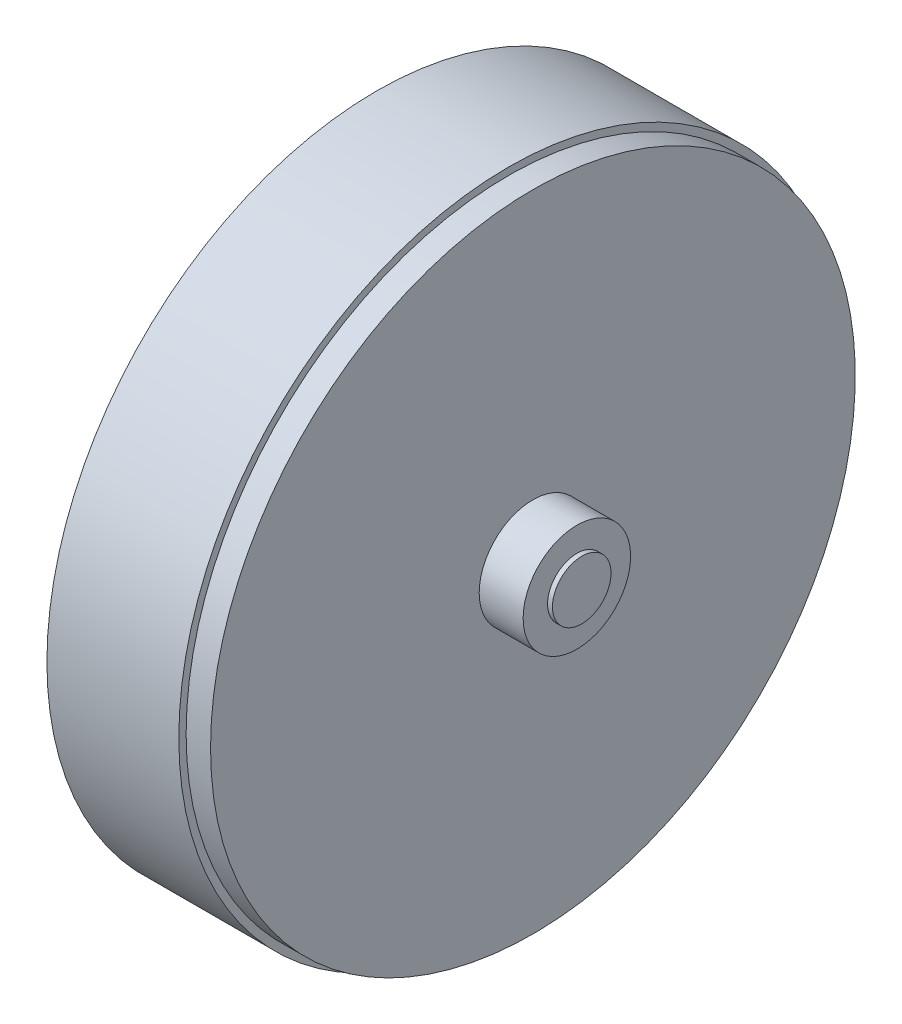
ISO-10303-21;
HEADER;
FILE_DESCRIPTION(('STEP AP214'),'2;1');
FILE_NAME('part.step','',(''),(''),'','','');
FILE_SCHEMA(('AUTOMOTIVE_DESIGN { 1 0 10303 214 1 1 1 1 }'));
ENDSEC;
DATA;
#1=APPLICATION_CONTEXT('core data for automotive mechanical design processes');
#2=APPLICATION_PROTOCOL_DEFINITION('international standard','automotive_design',2000,#1);
#3=PRODUCT_CONTEXT('',#1,'mechanical');
#4=PRODUCT('Part','Part','',(#3));
#5=PRODUCT_RELATED_PRODUCT_CATEGORY('part','',(#4));
#6=PRODUCT_DEFINITION_FORMATION('','',#4);
#7=PRODUCT_DEFINITION_CONTEXT('part definition',#1,'design');
#8=PRODUCT_DEFINITION('design','',#6,#7);
#9=PRODUCT_DEFINITION_SHAPE('','',#8);
#10=(LENGTH_UNIT() NAMED_UNIT(*) SI_UNIT(.MILLI.,.METRE.));
#11=(NAMED_UNIT(*) PLANE_ANGLE_UNIT() SI_UNIT($,.RADIAN.));
#12=(NAMED_UNIT(*) SI_UNIT($,.STERADIAN.) SOLID_ANGLE_UNIT());
#13=UNCERTAINTY_MEASURE_WITH_UNIT(LENGTH_MEASURE(1.E-05),#10,'distance_accuracy_value','');
#14=(GEOMETRIC_REPRESENTATION_CONTEXT(3) GLOBAL_UNCERTAINTY_ASSIGNED_CONTEXT((#13)) GLOBAL_UNIT_ASSIGNED_CONTEXT((#10,
#11,#12)) REPRESENTATION_CONTEXT('',''));
#15=CARTESIAN_POINT('',(0.,0.,0.));
#16=DIRECTION('',(0.,0.,1.));
#17=DIRECTION('',(1.,0.,0.));
#18=AXIS2_PLACEMENT_3D('',#15,#16,#17);
#19=CARTESIAN_POINT('',(0.,0.,0.));
#20=DIRECTION('',(-1.,0.,0.));
#21=DIRECTION('',(0.,0.,1.));
#22=AXIS2_PLACEMENT_3D('',#19,#20,#21);
#23=PLANE('',#22);
#24=CARTESIAN_POINT('',(0.,0.,0.));
#25=DIRECTION('',(-1.,0.,0.));
#26=DIRECTION('',(0.,0.,1.));
#27=AXIS2_PLACEMENT_3D('',#24,#25,#26);
#28=CIRCLE('',#27,3.);
#29=CARTESIAN_POINT('',(0.,0.,3.));
#30=VERTEX_POINT('',#29);
#31=EDGE_CURVE('E10',#30,#30,#28,.T.);
#32=ORIENTED_EDGE('',*,*,#31,.F.);
#33=EDGE_LOOP('',(#32));
#34=FACE_BOUND('',#33,.T.);
#35=ADVANCED_FACE('F44',(#34),#23,.F.);
#36=CARTESIAN_POINT('',(-34.0088849839102,0.,0.));
#37=DIRECTION('',(-1.,0.,0.));
#38=DIRECTION('',(0.,0.,1.));
#39=AXIS2_PLACEMENT_3D('',#36,#37,#38);
#40=CYLINDRICAL_SURFACE('',#39,3.);
#41=CARTESIAN_POINT('',(-0.5,0.,0.));
#42=DIRECTION('',(-1.,0.,0.));
#43=DIRECTION('',(0.,0.,1.));
#44=AXIS2_PLACEMENT_3D('',#41,#42,#43);
#45=CIRCLE('',#44,3.);
#46=CARTESIAN_POINT('',(-0.5,0.,3.));
#47=VERTEX_POINT('',#46);
#48=EDGE_CURVE('E55',#47,#47,#45,.T.);
#49=ORIENTED_EDGE('',*,*,#48,.F.);
#50=EDGE_LOOP('',(#49));
#51=FACE_BOUND('',#50,.T.);
#52=ORIENTED_EDGE('',*,*,#31,.T.);
#53=EDGE_LOOP('',(#52));
#54=FACE_BOUND('',#53,.T.);
#55=ADVANCED_FACE('F233',(#51,#54),#40,.T.);
#56=CARTESIAN_POINT('',(-0.5,3.,0.));
#57=DIRECTION('',(-1.,0.,0.));
#58=DIRECTION('',(0.,0.,1.));
#59=AXIS2_PLACEMENT_3D('',#56,#57,#58);
#60=PLANE('',#59);
#61=CARTESIAN_POINT('',(-0.5,0.,0.));
#62=DIRECTION('',(-1.,0.,0.));
#63=DIRECTION('',(0.,0.,1.));
#64=AXIS2_PLACEMENT_3D('',#61,#62,#63);
#65=CIRCLE('',#64,5.5);
#66=CARTESIAN_POINT('',(-0.5,0.,5.5));
#67=VERTEX_POINT('',#66);
#68=EDGE_CURVE('E60',#67,#67,#65,.T.);
#69=ORIENTED_EDGE('',*,*,#68,.F.);
#70=EDGE_LOOP('',(#69));
#71=FACE_BOUND('',#70,.T.);
#72=ORIENTED_EDGE('',*,*,#48,.T.);
#73=EDGE_LOOP('',(#72));
#74=FACE_BOUND('',#73,.T.);
#75=ADVANCED_FACE('F228',(#71,#74),#60,.F.);
#76=CARTESIAN_POINT('',(-34.0088849839102,0.,0.));
#77=DIRECTION('',(-1.,0.,0.));
#78=DIRECTION('',(0.,0.,1.));
#79=AXIS2_PLACEMENT_3D('',#76,#77,#78);
#80=CYLINDRICAL_SURFACE('',#79,5.5);
#81=CARTESIAN_POINT('',(-5.,0.,0.));
#82=DIRECTION('',(-1.,0.,0.));
#83=DIRECTION('',(0.,0.,1.));
#84=AXIS2_PLACEMENT_3D('',#81,#82,#83);
#85=CIRCLE('',#84,5.5);
#86=CARTESIAN_POINT('',(-5.,0.,5.5));
#87=VERTEX_POINT('',#86);
#88=EDGE_CURVE('E65',#87,#87,#85,.T.);
#89=ORIENTED_EDGE('',*,*,#88,.F.);
#90=EDGE_LOOP('',(#89));
#91=FACE_BOUND('',#90,.T.);
#92=ORIENTED_EDGE('',*,*,#68,.T.);
#93=EDGE_LOOP('',(#92));
#94=FACE_BOUND('',#93,.T.);
#95=ADVANCED_FACE('F219',(#91,#94),#80,.T.);
#96=CARTESIAN_POINT('',(-5.,5.5,0.));
#97=DIRECTION('',(-1.,0.,0.));
#98=DIRECTION('',(0.,0.,1.));
#99=AXIS2_PLACEMENT_3D('',#96,#97,#98);
#100=PLANE('',#99);
#101=CARTESIAN_POINT('',(-5.,0.,0.));
#102=DIRECTION('',(-1.,0.,0.));
#103=DIRECTION('',(0.,0.,1.));
#104=AXIS2_PLACEMENT_3D('',#101,#102,#103);
#105=CIRCLE('',#104,33.);
#106=CARTESIAN_POINT('',(-5.,0.,33.));
#107=VERTEX_POINT('',#106);
#108=EDGE_CURVE('E68',#107,#107,#105,.T.);
#109=ORIENTED_EDGE('',*,*,#108,.F.);
#110=EDGE_LOOP('',(#109));
#111=FACE_BOUND('',#110,.T.);
#112=ORIENTED_EDGE('',*,*,#88,.T.);
#113=EDGE_LOOP('',(#112));
#114=FACE_BOUND('',#113,.T.);
#115=ADVANCED_FACE('F211',(#111,#114),#100,.F.);
#116=CARTESIAN_POINT('',(-34.0088849839102,0.,0.));
#117=DIRECTION('',(-1.,0.,0.));
#118=DIRECTION('',(0.,0.,1.));
#119=AXIS2_PLACEMENT_3D('',#116,#117,#118);
#120=CYLINDRICAL_SURFACE('',#119,33.);
#121=CARTESIAN_POINT('',(-7.5,0.,0.));
#122=DIRECTION('',(-1.,0.,0.));
#123=DIRECTION('',(0.,0.,1.));
#124=AXIS2_PLACEMENT_3D('',#121,#122,#123);
#125=CIRCLE('',#124,33.);
#126=CARTESIAN_POINT('',(-7.5,0.,33.));
#127=VERTEX_POINT('',#126);
#128=EDGE_CURVE('E75',#127,#127,#125,.T.);
#129=ORIENTED_EDGE('',*,*,#128,.F.);
#130=EDGE_LOOP('',(#129));
#131=FACE_BOUND('',#130,.T.);
#132=ORIENTED_EDGE('',*,*,#108,.T.);
#133=EDGE_LOOP('',(#132));
#134=FACE_BOUND('',#133,.T.);
#135=ADVANCED_FACE('F206',(#131,#134),#120,.T.);
#136=CARTESIAN_POINT('',(-7.5,33.75,0.));
#137=DIRECTION('',(-1.,0.,0.));
#138=DIRECTION('',(0.,0.,1.));
#139=AXIS2_PLACEMENT_3D('',#136,#137,#138);
#140=PLANE('',#139);
#141=CARTESIAN_POINT('',(-7.5,0.,0.));
#142=DIRECTION('',(-1.,0.,0.));
#143=DIRECTION('',(0.,0.,1.));
#144=AXIS2_PLACEMENT_3D('',#141,#142,#143);
#145=CIRCLE('',#144,33.75);
#146=CARTESIAN_POINT('',(-7.5,0.,33.75));
#147=VERTEX_POINT('',#146);
#148=EDGE_CURVE('E77',#147,#147,#145,.T.);
#149=ORIENTED_EDGE('',*,*,#148,.F.);
#150=EDGE_LOOP('',(#149));
#151=FACE_BOUND('',#150,.T.);
#152=ORIENTED_EDGE('',*,*,#128,.T.);
#153=EDGE_LOOP('',(#152));
#154=FACE_BOUND('',#153,.T.);
#155=ADVANCED_FACE('F205',(#151,#154),#140,.F.);
#156=CARTESIAN_POINT('',(-34.0088849839102,0.,0.));
#157=DIRECTION('',(-1.,0.,0.));
#158=DIRECTION('',(0.,0.,1.));
#159=AXIS2_PLACEMENT_3D('',#156,#157,#158);
#160=CYLINDRICAL_SURFACE('',#159,33.75);
#161=CARTESIAN_POINT('',(-21.,0.,0.));
#162=DIRECTION('',(-1.,0.,0.));
#163=DIRECTION('',(0.,0.,1.));
#164=AXIS2_PLACEMENT_3D('',#161,#162,#163);
#165=CIRCLE('',#164,33.75);
#166=CARTESIAN_POINT('',(-21.,0.,33.75));
#167=VERTEX_POINT('',#166);
#168=EDGE_CURVE('E78',#167,#167,#165,.T.);
#169=ORIENTED_EDGE('',*,*,#168,.F.);
#170=EDGE_LOOP('',(#169));
#171=FACE_BOUND('',#170,.T.);
#172=ORIENTED_EDGE('',*,*,#148,.T.);
#173=EDGE_LOOP('',(#172));
#174=FACE_BOUND('',#173,.T.);
#175=ADVANCED_FACE('F196',(#171,#174),#160,.T.);
#176=CARTESIAN_POINT('',(-21.,33.75,0.));
#177=DIRECTION('',(1.,0.,0.));
#178=DIRECTION('',(0.,0.,-1.));
#179=AXIS2_PLACEMENT_3D('',#176,#177,#178);
#180=PLANE('',#179);
#181=CARTESIAN_POINT('',(-21.,0.,0.));
#182=DIRECTION('',(-1.,0.,0.));
#183=DIRECTION('',(0.,0.,1.));
#184=AXIS2_PLACEMENT_3D('',#181,#182,#183);
#185=CIRCLE('',#184,22.);
#186=CARTESIAN_POINT('',(-21.,0.,22.));
#187=VERTEX_POINT('',#186);
#188=EDGE_CURVE('E81',#187,#187,#185,.T.);
#189=ORIENTED_EDGE('',*,*,#188,.F.);
#190=EDGE_LOOP('',(#189));
#191=FACE_BOUND('',#190,.T.);
#192=ORIENTED_EDGE('',*,*,#168,.T.);
#193=EDGE_LOOP('',(#192));
#194=FACE_BOUND('',#193,.T.);
#195=ADVANCED_FACE('F188',(#191,#194),#180,.F.);
#196=CARTESIAN_POINT('',(-34.0088849839102,0.,0.));
#197=DIRECTION('',(-1.,0.,0.));
#198=DIRECTION('',(0.,0.,1.));
#199=AXIS2_PLACEMENT_3D('',#196,#197,#198);
#200=CYLINDRICAL_SURFACE('',#199,22.);
#201=CARTESIAN_POINT('',(-25.,0.,0.));
#202=DIRECTION('',(-1.,0.,0.));
#203=DIRECTION('',(0.,0.,1.));
#204=AXIS2_PLACEMENT_3D('',#201,#202,#203);
#205=CIRCLE('',#204,22.);
#206=CARTESIAN_POINT('',(-25.,0.,22.));
#207=VERTEX_POINT('',#206);
#208=EDGE_CURVE('E88',#207,#207,#205,.T.);
#209=ORIENTED_EDGE('',*,*,#208,.F.);
#210=EDGE_LOOP('',(#209));
#211=FACE_BOUND('',#210,.T.);
#212=ORIENTED_EDGE('',*,*,#188,.T.);
#213=EDGE_LOOP('',(#212));
#214=FACE_BOUND('',#213,.T.);
#215=ADVANCED_FACE('F177',(#211,#214),#200,.T.);
#216=CARTESIAN_POINT('',(-25.,22.,0.));
#217=DIRECTION('',(1.,0.,0.));
#218=DIRECTION('',(0.,0.,-1.));
#219=AXIS2_PLACEMENT_3D('',#216,#217,#218);
#220=PLANE('',#219);
#221=CARTESIAN_POINT('',(-25.,7.74933950539307,-18.7085605333536));
#222=DIRECTION('',(-1.,0.,0.));
#223=DIRECTION('',(0.,0.,1.));
#224=AXIS2_PLACEMENT_3D('',#221,#222,#223);
#225=CIRCLE('',#224,1.25);
#226=CARTESIAN_POINT('',(-25.,7.74933950539307,-17.4585605333536));
#227=VERTEX_POINT('',#226);
#228=EDGE_CURVE('E122',#227,#227,#225,.T.);
#229=ORIENTED_EDGE('',*,*,#228,.F.);
#230=EDGE_LOOP('',(#229));
#231=FACE_BOUND('',#230,.T.);
#232=CARTESIAN_POINT('',(-25.,-7.74933950539307,-18.7085605333536));
#233=DIRECTION('',(-1.,0.,0.));
#234=DIRECTION('',(0.,0.,1.));
#235=AXIS2_PLACEMENT_3D('',#232,#233,#234);
#236=CIRCLE('',#235,1.25);
#237=CARTESIAN_POINT('',(-25.,-7.74933950539307,-17.4585605333536));
#238=VERTEX_POINT('',#237);
#239=EDGE_CURVE('E126',#238,#238,#236,.T.);
#240=ORIENTED_EDGE('',*,*,#239,.F.);
#241=EDGE_LOOP('',(#240));
#242=FACE_BOUND('',#241,.T.);
#243=CARTESIAN_POINT('',(-25.,-18.7085605333536,-7.74933950539306));
#244=DIRECTION('',(-1.,0.,0.));
#245=DIRECTION('',(0.,0.,1.));
#246=AXIS2_PLACEMENT_3D('',#243,#244,#245);
#247=CIRCLE('',#246,1.25);
#248=CARTESIAN_POINT('',(-25.,-18.7085605333536,-6.49933950539307));
#249=VERTEX_POINT('',#248);
#250=EDGE_CURVE('E140',#249,#249,#247,.T.);
#251=ORIENTED_EDGE('',*,*,#250,.F.);
#252=EDGE_LOOP('',(#251));
#253=FACE_BOUND('',#252,.T.);
#254=CARTESIAN_POINT('',(-25.,-18.7085605333536,7.74933950539307));
#255=DIRECTION('',(-1.,0.,0.));
#256=DIRECTION('',(0.,0.,1.));
#257=AXIS2_PLACEMENT_3D('',#254,#255,#256);
#258=CIRCLE('',#257,1.25);
#259=CARTESIAN_POINT('',(-25.,-18.7085605333536,8.99933950539307));
#260=VERTEX_POINT('',#259);
#261=EDGE_CURVE('E143',#260,#260,#258,.T.);
#262=ORIENTED_EDGE('',*,*,#261,.F.);
#263=EDGE_LOOP('',(#262));
#264=FACE_BOUND('',#263,.T.);
#265=CARTESIAN_POINT('',(-25.,-7.74933950539307,18.7085605333536));
#266=DIRECTION('',(-1.,0.,0.));
#267=DIRECTION('',(0.,0.,1.));
#268=AXIS2_PLACEMENT_3D('',#265,#266,#267);
#269=CIRCLE('',#268,1.25);
#270=CARTESIAN_POINT('',(-25.,-7.74933950539307,19.9585605333536));
#271=VERTEX_POINT('',#270);
#272=EDGE_CURVE('E153',#271,#271,#269,.T.);
#273=ORIENTED_EDGE('',*,*,#272,.F.);
#274=EDGE_LOOP('',(#273));
#275=FACE_BOUND('',#274,.T.);
#276=CARTESIAN_POINT('',(-25.,7.74933950539307,18.7085605333536));
#277=DIRECTION('',(-1.,0.,0.));
#278=DIRECTION('',(0.,0.,1.));
#279=AXIS2_PLACEMENT_3D('',#276,#277,#278);
#280=CIRCLE('',#279,1.25);
#281=CARTESIAN_POINT('',(-25.,7.74933950539307,19.9585605333536));
#282=VERTEX_POINT('',#281);
#283=EDGE_CURVE('E163',#282,#282,#280,.T.);
#284=ORIENTED_EDGE('',*,*,#283,.F.);
#285=EDGE_LOOP('',(#284));
#286=FACE_BOUND('',#285,.T.);
#287=CARTESIAN_POINT('',(-25.,18.7085605333536,7.74933950539307));
#288=DIRECTION('',(-1.,0.,0.));
#289=DIRECTION('',(0.,0.,1.));
#290=AXIS2_PLACEMENT_3D('',#287,#288,#289);
#291=CIRCLE('',#290,1.25);
#292=CARTESIAN_POINT('',(-25.,18.7085605333536,8.99933950539306));
#293=VERTEX_POINT('',#292);
#294=EDGE_CURVE('E113',#293,#293,#291,.T.);
#295=ORIENTED_EDGE('',*,*,#294,.F.);
#296=EDGE_LOOP('',(#295));
#297=FACE_BOUND('',#296,.T.);
#298=CARTESIAN_POINT('',(-25.,18.7085605333536,-7.74933950539307));
#299=DIRECTION('',(-1.,0.,0.));
#300=DIRECTION('',(0.,0.,1.));
#301=AXIS2_PLACEMENT_3D('',#298,#299,#300);
#302=CIRCLE('',#301,1.25);
#303=CARTESIAN_POINT('',(-25.,18.7085605333536,-6.49933950539307));
#304=VERTEX_POINT('',#303);
#305=EDGE_CURVE('E107',#304,#304,#302,.T.);
#306=ORIENTED_EDGE('',*,*,#305,.F.);
#307=EDGE_LOOP('',(#306));
#308=FACE_BOUND('',#307,.T.);
#309=CARTESIAN_POINT('',(-25.,0.,0.));
#310=DIRECTION('',(-1.,0.,0.));
#311=DIRECTION('',(0.,0.,1.));
#312=AXIS2_PLACEMENT_3D('',#309,#310,#311);
#313=CIRCLE('',#312,18.);
#314=CARTESIAN_POINT('',(-25.,0.,18.));
#315=VERTEX_POINT('',#314);
#316=EDGE_CURVE('E95',#315,#315,#313,.T.);
#317=ORIENTED_EDGE('',*,*,#316,.F.);
#318=EDGE_LOOP('',(#317));
#319=FACE_BOUND('',#318,.T.);
#320=ORIENTED_EDGE('',*,*,#208,.T.);
#321=EDGE_LOOP('',(#320));
#322=FACE_BOUND('',#321,.T.);
#323=ADVANCED_FACE('F174',(#231,#242,#253,#264,#275,#286,#297,#308,#319,#322),#220,.F.);
#324=CARTESIAN_POINT('',(-34.0088849839102,0.,0.));
#325=DIRECTION('',(-1.,0.,0.));
#326=DIRECTION('',(0.,0.,1.));
#327=AXIS2_PLACEMENT_3D('',#324,#325,#326);
#328=CYLINDRICAL_SURFACE('',#327,18.);
#329=CARTESIAN_POINT('',(-27.,0.,0.));
#330=DIRECTION('',(-1.,0.,0.));
#331=DIRECTION('',(0.,0.,1.));
#332=AXIS2_PLACEMENT_3D('',#329,#330,#331);
#333=CIRCLE('',#332,18.);
#334=CARTESIAN_POINT('',(-27.,0.,18.));
#335=VERTEX_POINT('',#334);
#336=EDGE_CURVE('E98',#335,#335,#333,.T.);
#337=ORIENTED_EDGE('',*,*,#336,.F.);
#338=EDGE_LOOP('',(#337));
#339=FACE_BOUND('',#338,.T.);
#340=ORIENTED_EDGE('',*,*,#316,.T.);
#341=EDGE_LOOP('',(#340));
#342=FACE_BOUND('',#341,.T.);
#343=ADVANCED_FACE('F178',(#339,#342),#328,.T.);
#344=CARTESIAN_POINT('',(-27.,18.,0.));
#345=DIRECTION('',(1.,0.,0.));
#346=DIRECTION('',(0.,0.,-1.));
#347=AXIS2_PLACEMENT_3D('',#344,#345,#346);
#348=PLANE('',#347);
#349=CARTESIAN_POINT('',(-27.,0.,0.));
#350=DIRECTION('',(-1.,0.,0.));
#351=DIRECTION('',(0.,0.,1.));
#352=AXIS2_PLACEMENT_3D('',#349,#350,#351);
#353=CIRCLE('',#352,17.);
#354=CARTESIAN_POINT('',(-27.,0.,17.));
#355=VERTEX_POINT('',#354);
#356=EDGE_CURVE('E99',#355,#355,#353,.T.);
#357=ORIENTED_EDGE('',*,*,#356,.F.);
#358=EDGE_LOOP('',(#357));
#359=FACE_BOUND('',#358,.T.);
#360=ORIENTED_EDGE('',*,*,#336,.T.);
#361=EDGE_LOOP('',(#360));
#362=FACE_BOUND('',#361,.T.);
#363=ADVANCED_FACE('F309',(#359,#362),#348,.F.);
#364=CARTESIAN_POINT('',(-34.0088849839102,0.,0.));
#365=DIRECTION('',(-1.,0.,0.));
#366=DIRECTION('',(0.,0.,1.));
#367=AXIS2_PLACEMENT_3D('',#364,#365,#366);
#368=CYLINDRICAL_SURFACE('',#367,17.);
#369=CARTESIAN_POINT('',(-30.5,0.,0.));
#370=DIRECTION('',(-1.,0.,0.));
#371=DIRECTION('',(0.,0.,1.));
#372=AXIS2_PLACEMENT_3D('',#369,#370,#371);
#373=CIRCLE('',#372,17.);
#374=CARTESIAN_POINT('',(-30.5,0.,17.));
#375=VERTEX_POINT('',#374);
#376=EDGE_CURVE('E104',#375,#375,#373,.T.);
#377=ORIENTED_EDGE('',*,*,#376,.F.);
#378=EDGE_LOOP('',(#377));
#379=FACE_BOUND('',#378,.T.);
#380=ORIENTED_EDGE('',*,*,#356,.T.);
#381=EDGE_LOOP('',(#380));
#382=FACE_BOUND('',#381,.T.);
#383=ADVANCED_FACE('F318',(#379,#382),#368,.T.);
#384=CARTESIAN_POINT('',(-30.5,17.,0.));
#385=DIRECTION('',(1.,0.,0.));
#386=DIRECTION('',(0.,0.,-1.));
#387=AXIS2_PLACEMENT_3D('',#384,#385,#386);
#388=PLANE('',#387);
#389=ORIENTED_EDGE('',*,*,#376,.T.);
#390=EDGE_LOOP('',(#389));
#391=FACE_BOUND('',#390,.T.);
#392=ADVANCED_FACE('F329',(#391),#388,.F.);
#393=CARTESIAN_POINT('',(-21.,18.7085605333536,-7.74933950539307));
#394=DIRECTION('',(-1.,0.,0.));
#395=DIRECTION('',(0.,0.,1.));
#396=AXIS2_PLACEMENT_3D('',#393,#394,#395);
#397=CYLINDRICAL_SURFACE('',#396,1.25);
#398=CARTESIAN_POINT('',(-21.,18.7085605333536,-7.74933950539307));
#399=DIRECTION('',(-1.,0.,0.));
#400=DIRECTION('',(0.,0.,1.));
#401=AXIS2_PLACEMENT_3D('',#398,#399,#400);
#402=CIRCLE('',#401,1.25);
#403=CARTESIAN_POINT('',(-21.,18.7085605333536,-6.49933950539307));
#404=VERTEX_POINT('',#403);
#405=EDGE_CURVE('E108',#404,#404,#402,.T.);
#406=ORIENTED_EDGE('',*,*,#405,.F.);
#407=EDGE_LOOP('',(#406));
#408=FACE_BOUND('',#407,.T.);
#409=ORIENTED_EDGE('',*,*,#305,.T.);
#410=EDGE_LOOP('',(#409));
#411=FACE_BOUND('',#410,.T.);
#412=ADVANCED_FACE('F339',(#408,#411),#397,.F.);
#413=CARTESIAN_POINT('',(-21.,18.7085605333536,-7.74933950539307));
#414=DIRECTION('',(-1.,0.,0.));
#415=DIRECTION('',(0.,0.,1.));
#416=AXIS2_PLACEMENT_3D('',#413,#414,#415);
#417=PLANE('',#416);
#418=ORIENTED_EDGE('',*,*,#405,.T.);
#419=EDGE_LOOP('',(#418));
#420=FACE_BOUND('',#419,.T.);
#421=ADVANCED_FACE('F348',(#420),#417,.T.);
#422=CARTESIAN_POINT('',(-21.,18.7085605333536,7.74933950539307));
#423=DIRECTION('',(-1.,0.,0.));
#424=DIRECTION('',(0.,0.,1.));
#425=AXIS2_PLACEMENT_3D('',#422,#423,#424);
#426=CYLINDRICAL_SURFACE('',#425,1.25);
#427=CARTESIAN_POINT('',(-21.,18.7085605333536,7.74933950539307));
#428=DIRECTION('',(-1.,0.,0.));
#429=DIRECTION('',(0.,0.,1.));
#430=AXIS2_PLACEMENT_3D('',#427,#428,#429);
#431=CIRCLE('',#430,1.25);
#432=CARTESIAN_POINT('',(-21.,18.7085605333536,8.99933950539306));
#433=VERTEX_POINT('',#432);
#434=EDGE_CURVE('E164',#433,#433,#431,.T.);
#435=ORIENTED_EDGE('',*,*,#434,.F.);
#436=EDGE_LOOP('',(#435));
#437=FACE_BOUND('',#436,.T.);
#438=ORIENTED_EDGE('',*,*,#294,.T.);
#439=EDGE_LOOP('',(#438));
#440=FACE_BOUND('',#439,.T.);
#441=ADVANCED_FACE('F173',(#437,#440),#426,.F.);
#442=CARTESIAN_POINT('',(-21.,18.7085605333536,7.74933950539307));
#443=DIRECTION('',(-1.,0.,0.));
#444=DIRECTION('',(0.,0.,1.));
#445=AXIS2_PLACEMENT_3D('',#442,#443,#444);
#446=PLANE('',#445);
#447=ORIENTED_EDGE('',*,*,#434,.T.);
#448=EDGE_LOOP('',(#447));
#449=FACE_BOUND('',#448,.T.);
#450=ADVANCED_FACE('F370',(#449),#446,.T.);
#451=CARTESIAN_POINT('',(-21.,7.74933950539307,18.7085605333536));
#452=DIRECTION('',(-1.,0.,0.));
#453=DIRECTION('',(0.,0.,1.));
#454=AXIS2_PLACEMENT_3D('',#451,#452,#453);
#455=CYLINDRICAL_SURFACE('',#454,1.25);
#456=CARTESIAN_POINT('',(-21.,7.74933950539307,18.7085605333536));
#457=DIRECTION('',(-1.,0.,0.));
#458=DIRECTION('',(0.,0.,1.));
#459=AXIS2_PLACEMENT_3D('',#456,#457,#458);
#460=CIRCLE('',#459,1.25);
#461=CARTESIAN_POINT('',(-21.,7.74933950539307,19.9585605333536));
#462=VERTEX_POINT('',#461);
#463=EDGE_CURVE('E160',#462,#462,#460,.T.);
#464=ORIENTED_EDGE('',*,*,#463,.F.);
#465=EDGE_LOOP('',(#464));
#466=FACE_BOUND('',#465,.T.);
#467=ORIENTED_EDGE('',*,*,#283,.T.);
#468=EDGE_LOOP('',(#467));
#469=FACE_BOUND('',#468,.T.);
#470=ADVANCED_FACE('F380',(#466,#469),#455,.F.);
#471=CARTESIAN_POINT('',(-21.,7.74933950539307,18.7085605333536));
#472=DIRECTION('',(-1.,0.,0.));
#473=DIRECTION('',(0.,0.,1.));
#474=AXIS2_PLACEMENT_3D('',#471,#472,#473);
#475=PLANE('',#474);
#476=ORIENTED_EDGE('',*,*,#463,.T.);
#477=EDGE_LOOP('',(#476));
#478=FACE_BOUND('',#477,.T.);
#479=ADVANCED_FACE('F390',(#478),#475,.T.);
#480=CARTESIAN_POINT('',(-21.,-7.74933950539307,18.7085605333536));
#481=DIRECTION('',(-1.,0.,0.));
#482=DIRECTION('',(0.,0.,1.));
#483=AXIS2_PLACEMENT_3D('',#480,#481,#482);
#484=CYLINDRICAL_SURFACE('',#483,1.25);
#485=CARTESIAN_POINT('',(-21.,-7.74933950539307,18.7085605333536));
#486=DIRECTION('',(-1.,0.,0.));
#487=DIRECTION('',(0.,0.,1.));
#488=AXIS2_PLACEMENT_3D('',#485,#486,#487);
#489=CIRCLE('',#488,1.25);
#490=CARTESIAN_POINT('',(-21.,-7.74933950539307,19.9585605333536));
#491=VERTEX_POINT('',#490);
#492=EDGE_CURVE('E146',#491,#491,#489,.T.);
#493=ORIENTED_EDGE('',*,*,#492,.F.);
#494=EDGE_LOOP('',(#493));
#495=FACE_BOUND('',#494,.T.);
#496=ORIENTED_EDGE('',*,*,#272,.T.);
#497=EDGE_LOOP('',(#496));
#498=FACE_BOUND('',#497,.T.);
#499=ADVANCED_FACE('F400',(#495,#498),#484,.F.);
#500=CARTESIAN_POINT('',(-21.,-7.74933950539307,18.7085605333536));
#501=DIRECTION('',(-1.,0.,0.));
#502=DIRECTION('',(0.,0.,1.));
#503=AXIS2_PLACEMENT_3D('',#500,#501,#502);
#504=PLANE('',#503);
#505=ORIENTED_EDGE('',*,*,#492,.T.);
#506=EDGE_LOOP('',(#505));
#507=FACE_BOUND('',#506,.T.);
#508=ADVANCED_FACE('F410',(#507),#504,.T.);
#509=CARTESIAN_POINT('',(-21.,-18.7085605333536,7.74933950539307));
#510=DIRECTION('',(-1.,0.,0.));
#511=DIRECTION('',(0.,0.,1.));
#512=AXIS2_PLACEMENT_3D('',#509,#510,#511);
#513=CYLINDRICAL_SURFACE('',#512,1.25);
#514=CARTESIAN_POINT('',(-21.,-18.7085605333536,7.74933950539307));
#515=DIRECTION('',(-1.,0.,0.));
#516=DIRECTION('',(0.,0.,1.));
#517=AXIS2_PLACEMENT_3D('',#514,#515,#516);
#518=CIRCLE('',#517,1.25);
#519=CARTESIAN_POINT('',(-21.,-18.7085605333536,8.99933950539307));
#520=VERTEX_POINT('',#519);
#521=EDGE_CURVE('E142',#520,#520,#518,.T.);
#522=ORIENTED_EDGE('',*,*,#521,.F.);
#523=EDGE_LOOP('',(#522));
#524=FACE_BOUND('',#523,.T.);
#525=ORIENTED_EDGE('',*,*,#261,.T.);
#526=EDGE_LOOP('',(#525));
#527=FACE_BOUND('',#526,.T.);
#528=ADVANCED_FACE('F420',(#524,#527),#513,.F.);
#529=CARTESIAN_POINT('',(-21.,-18.7085605333536,7.74933950539307));
#530=DIRECTION('',(-1.,0.,0.));
#531=DIRECTION('',(0.,0.,1.));
#532=AXIS2_PLACEMENT_3D('',#529,#530,#531);
#533=PLANE('',#532);
#534=ORIENTED_EDGE('',*,*,#521,.T.);
#535=EDGE_LOOP('',(#534));
#536=FACE_BOUND('',#535,.T.);
#537=ADVANCED_FACE('F430',(#536),#533,.T.);
#538=CARTESIAN_POINT('',(-21.,-18.7085605333536,-7.74933950539306));
#539=DIRECTION('',(-1.,0.,0.));
#540=DIRECTION('',(0.,0.,1.));
#541=AXIS2_PLACEMENT_3D('',#538,#539,#540);
#542=CYLINDRICAL_SURFACE('',#541,1.25);
#543=CARTESIAN_POINT('',(-21.,-18.7085605333536,-7.74933950539306));
#544=DIRECTION('',(-1.,0.,0.));
#545=DIRECTION('',(0.,0.,1.));
#546=AXIS2_PLACEMENT_3D('',#543,#544,#545);
#547=CIRCLE('',#546,1.25);
#548=CARTESIAN_POINT('',(-21.,-18.7085605333536,-6.49933950539307));
#549=VERTEX_POINT('',#548);
#550=EDGE_CURVE('E133',#549,#549,#547,.T.);
#551=ORIENTED_EDGE('',*,*,#550,.F.);
#552=EDGE_LOOP('',(#551));
#553=FACE_BOUND('',#552,.T.);
#554=ORIENTED_EDGE('',*,*,#250,.T.);
#555=EDGE_LOOP('',(#554));
#556=FACE_BOUND('',#555,.T.);
#557=ADVANCED_FACE('F440',(#553,#556),#542,.F.);
#558=CARTESIAN_POINT('',(-21.,-18.7085605333536,-7.74933950539306));
#559=DIRECTION('',(-1.,0.,0.));
#560=DIRECTION('',(0.,0.,1.));
#561=AXIS2_PLACEMENT_3D('',#558,#559,#560);
#562=PLANE('',#561);
#563=ORIENTED_EDGE('',*,*,#550,.T.);
#564=EDGE_LOOP('',(#563));
#565=FACE_BOUND('',#564,.T.);
#566=ADVANCED_FACE('F450',(#565),#562,.T.);
#567=CARTESIAN_POINT('',(-21.,-7.74933950539307,-18.7085605333536));
#568=DIRECTION('',(-1.,0.,0.));
#569=DIRECTION('',(0.,0.,1.));
#570=AXIS2_PLACEMENT_3D('',#567,#568,#569);
#571=CYLINDRICAL_SURFACE('',#570,1.25);
#572=CARTESIAN_POINT('',(-21.,-7.74933950539307,-18.7085605333536));
#573=DIRECTION('',(-1.,0.,0.));
#574=DIRECTION('',(0.,0.,1.));
#575=AXIS2_PLACEMENT_3D('',#572,#573,#574);
#576=CIRCLE('',#575,1.25);
#577=CARTESIAN_POINT('',(-21.,-7.74933950539307,-17.4585605333536));
#578=VERTEX_POINT('',#577);
#579=EDGE_CURVE('E123',#578,#578,#576,.T.);
#580=ORIENTED_EDGE('',*,*,#579,.F.);
#581=EDGE_LOOP('',(#580));
#582=FACE_BOUND('',#581,.T.);
#583=ORIENTED_EDGE('',*,*,#239,.T.);
#584=EDGE_LOOP('',(#583));
#585=FACE_BOUND('',#584,.T.);
#586=ADVANCED_FACE('F460',(#582,#585),#571,.F.);
#587=CARTESIAN_POINT('',(-21.,-7.74933950539307,-18.7085605333536));
#588=DIRECTION('',(-1.,0.,0.));
#589=DIRECTION('',(0.,0.,1.));
#590=AXIS2_PLACEMENT_3D('',#587,#588,#589);
#591=PLANE('',#590);
#592=ORIENTED_EDGE('',*,*,#579,.T.);
#593=EDGE_LOOP('',(#592));
#594=FACE_BOUND('',#593,.T.);
#595=ADVANCED_FACE('F470',(#594),#591,.T.);
#596=CARTESIAN_POINT('',(-21.,7.74933950539307,-18.7085605333536));
#597=DIRECTION('',(-1.,0.,0.));
#598=DIRECTION('',(0.,0.,1.));
#599=AXIS2_PLACEMENT_3D('',#596,#597,#598);
#600=CYLINDRICAL_SURFACE('',#599,1.25);
#601=CARTESIAN_POINT('',(-21.,7.74933950539307,-18.7085605333536));
#602=DIRECTION('',(-1.,0.,0.));
#603=DIRECTION('',(0.,0.,1.));
#604=AXIS2_PLACEMENT_3D('',#601,#602,#603);
#605=CIRCLE('',#604,1.25);
#606=CARTESIAN_POINT('',(-21.,7.74933950539307,-17.4585605333536));
#607=VERTEX_POINT('',#606);
#608=EDGE_CURVE('E120',#607,#607,#605,.T.);
#609=ORIENTED_EDGE('',*,*,#608,.F.);
#610=EDGE_LOOP('',(#609));
#611=FACE_BOUND('',#610,.T.);
#612=ORIENTED_EDGE('',*,*,#228,.T.);
#613=EDGE_LOOP('',(#612));
#614=FACE_BOUND('',#613,.T.);
#615=ADVANCED_FACE('F480',(#611,#614),#600,.F.);
#616=CARTESIAN_POINT('',(-21.,7.74933950539307,-18.7085605333536));
#617=DIRECTION('',(-1.,0.,0.));
#618=DIRECTION('',(0.,0.,1.));
#619=AXIS2_PLACEMENT_3D('',#616,#617,#618);
#620=PLANE('',#619);
#621=ORIENTED_EDGE('',*,*,#608,.T.);
#622=EDGE_LOOP('',(#621));
#623=FACE_BOUND('',#622,.T.);
#624=ADVANCED_FACE('F487',(#623),#620,.T.);
#625=CLOSED_SHELL('',(#35,#55,#75,#95,#115,#135,#155,#175,#195,#215,#323,#343,#363,#383,#392,
#412,#421,#441,#450,#470,#479,#499,#508,#528,#537,#557,#566,#586,#595,#615,#624));
#626=MANIFOLD_SOLID_BREP('B2',#625);
#627=ADVANCED_BREP_SHAPE_REPRESENTATION('',(#18,#626),#14);
#628=SHAPE_DEFINITION_REPRESENTATION(#9,#627);
ENDSEC;
END-ISO-10303-21;
